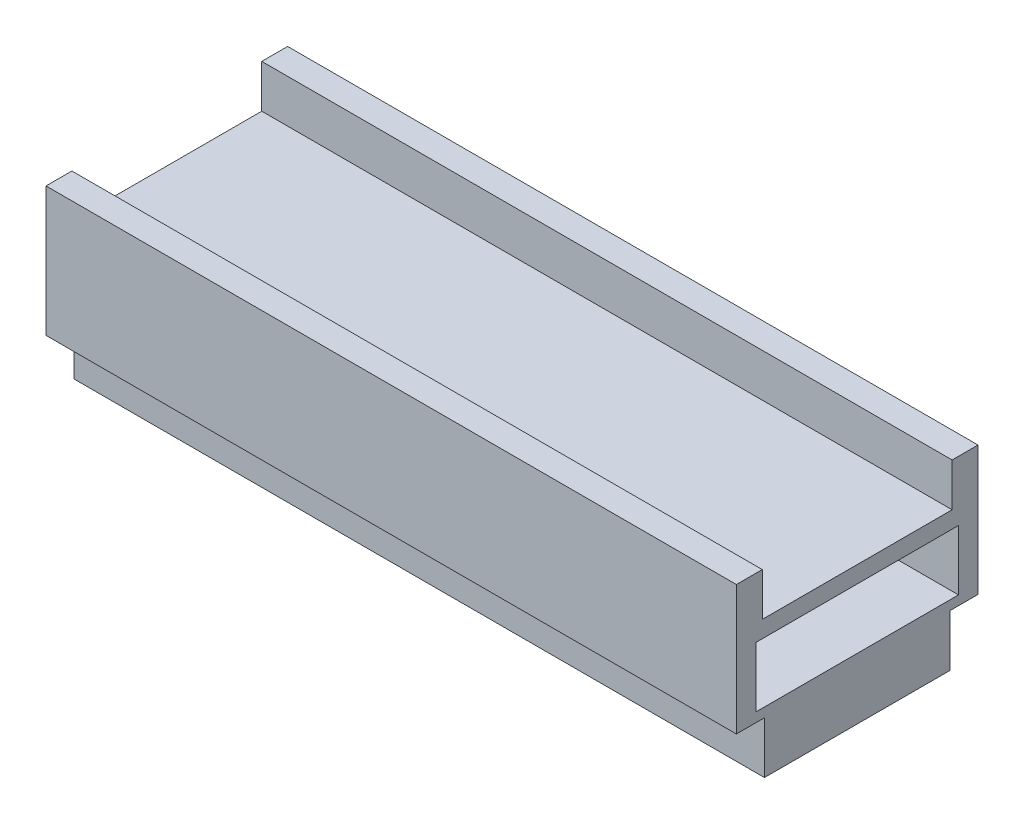
ISO-10303-21;
HEADER;
FILE_DESCRIPTION(('STEP AP214'),'2;1');
FILE_NAME('part.step','',(''),(''),'','','');
FILE_SCHEMA(('AUTOMOTIVE_DESIGN { 1 0 10303 214 1 1 1 1 }'));
ENDSEC;
DATA;
#1=APPLICATION_CONTEXT('core data for automotive mechanical design processes');
#2=APPLICATION_PROTOCOL_DEFINITION('international standard','automotive_design',2000,#1);
#3=PRODUCT_CONTEXT('',#1,'mechanical');
#4=PRODUCT('Part','Part','',(#3));
#5=PRODUCT_RELATED_PRODUCT_CATEGORY('part','',(#4));
#6=PRODUCT_DEFINITION_FORMATION('','',#4);
#7=PRODUCT_DEFINITION_CONTEXT('part definition',#1,'design');
#8=PRODUCT_DEFINITION('design','',#6,#7);
#9=PRODUCT_DEFINITION_SHAPE('','',#8);
#10=(LENGTH_UNIT() NAMED_UNIT(*) SI_UNIT(.MILLI.,.METRE.));
#11=(NAMED_UNIT(*) PLANE_ANGLE_UNIT() SI_UNIT($,.RADIAN.));
#12=(NAMED_UNIT(*) SI_UNIT($,.STERADIAN.) SOLID_ANGLE_UNIT());
#13=UNCERTAINTY_MEASURE_WITH_UNIT(LENGTH_MEASURE(1.E-05),#10,'distance_accuracy_value','');
#14=(GEOMETRIC_REPRESENTATION_CONTEXT(3) GLOBAL_UNCERTAINTY_ASSIGNED_CONTEXT((#13)) GLOBAL_UNIT_ASSIGNED_CONTEXT((#10,
#11,#12)) REPRESENTATION_CONTEXT('',''));
#15=CARTESIAN_POINT('',(0.,0.,0.));
#16=DIRECTION('',(0.,0.,1.));
#17=DIRECTION('',(1.,0.,0.));
#18=AXIS2_PLACEMENT_3D('',#15,#16,#17);
#19=CARTESIAN_POINT('',(0.,21.,0.));
#20=DIRECTION('',(0.,1.,0.));
#21=DIRECTION('',(0.,0.,1.));
#22=AXIS2_PLACEMENT_3D('',#19,#20,#21);
#23=PLANE('',#22);
#24=DIRECTION('',(-1.,0.,0.));
#25=VECTOR('',#24,1.);
#26=CARTESIAN_POINT('',(-40.,21.,-11.));
#27=LINE('',#26,#25);
#28=CARTESIAN_POINT('',(40.,21.,-11.));
#29=VERTEX_POINT('',#28);
#30=CARTESIAN_POINT('',(-40.,21.,-11.));
#31=VERTEX_POINT('',#30);
#32=EDGE_CURVE('E167',#29,#31,#27,.T.);
#33=ORIENTED_EDGE('',*,*,#32,.F.);
#34=DIRECTION('',(0.,0.,-1.));
#35=VECTOR('',#34,1.);
#36=CARTESIAN_POINT('',(40.,21.,-14.));
#37=LINE('',#36,#35);
#38=CARTESIAN_POINT('',(40.,21.,-14.));
#39=VERTEX_POINT('',#38);
#40=EDGE_CURVE('E220',#29,#39,#37,.T.);
#41=ORIENTED_EDGE('',*,*,#40,.T.);
#42=DIRECTION('',(-1.,0.,0.));
#43=VECTOR('',#42,1.);
#44=CARTESIAN_POINT('',(-40.,21.,-14.));
#45=LINE('',#44,#43);
#46=CARTESIAN_POINT('',(-40.,21.,-14.));
#47=VERTEX_POINT('',#46);
#48=EDGE_CURVE('E216',#39,#47,#45,.T.);
#49=ORIENTED_EDGE('',*,*,#48,.T.);
#50=DIRECTION('',(0.,0.,1.));
#51=VECTOR('',#50,1.);
#52=CARTESIAN_POINT('',(-40.,21.,-14.));
#53=LINE('',#52,#51);
#54=EDGE_CURVE('E219',#47,#31,#53,.T.);
#55=ORIENTED_EDGE('',*,*,#54,.T.);
#56=EDGE_LOOP('',(#33,#41,#49,#55));
#57=FACE_BOUND('',#56,.T.);
#58=ADVANCED_FACE('F39',(#57),#23,.T.);
#59=CARTESIAN_POINT('',(40.,6.,-10.75));
#60=DIRECTION('',(-1.,0.,0.));
#61=DIRECTION('',(0.,0.,1.));
#62=AXIS2_PLACEMENT_3D('',#59,#60,#61);
#63=PLANE('',#62);
#64=DIRECTION('',(0.,0.,1.));
#65=VECTOR('',#64,1.);
#66=CARTESIAN_POINT('',(40.,14.054050925553,11.7433662398209));
#67=LINE('',#66,#65);
#68=CARTESIAN_POINT('',(40.,14.054050925553,-11.7433662398209));
#69=VERTEX_POINT('',#68);
#70=CARTESIAN_POINT('',(40.,14.054050925553,11.7433662398209));
#71=VERTEX_POINT('',#70);
#72=EDGE_CURVE('E174',#69,#71,#67,.T.);
#73=ORIENTED_EDGE('',*,*,#72,.F.);
#74=DIRECTION('',(0.,1.,0.));
#75=VECTOR('',#74,1.);
#76=CARTESIAN_POINT('',(40.,14.054050925553,-11.7433662398209));
#77=LINE('',#76,#75);
#78=CARTESIAN_POINT('',(40.,7.0853236205476,-11.7433662398209));
#79=VERTEX_POINT('',#78);
#80=EDGE_CURVE('E53',#79,#69,#77,.T.);
#81=ORIENTED_EDGE('',*,*,#80,.F.);
#82=DIRECTION('',(0.,0.,-1.));
#83=VECTOR('',#82,1.);
#84=CARTESIAN_POINT('',(40.,7.0853236205476,11.7433662398209));
#85=LINE('',#84,#83);
#86=CARTESIAN_POINT('',(40.,7.0853236205476,11.7433662398209));
#87=VERTEX_POINT('',#86);
#88=EDGE_CURVE('E159',#87,#79,#85,.T.);
#89=ORIENTED_EDGE('',*,*,#88,.F.);
#90=DIRECTION('',(0.,-1.,0.));
#91=VECTOR('',#90,1.);
#92=CARTESIAN_POINT('',(40.,14.054050925553,11.7433662398209));
#93=LINE('',#92,#91);
#94=EDGE_CURVE('E180',#71,#87,#93,.T.);
#95=ORIENTED_EDGE('',*,*,#94,.F.);
#96=EDGE_LOOP('',(#73,#81,#89,#95));
#97=FACE_BOUND('',#96,.T.);
#98=DIRECTION('',(0.,0.,-1.));
#99=VECTOR('',#98,1.);
#100=CARTESIAN_POINT('',(40.,16.,-11.));
#101=LINE('',#100,#99);
#102=CARTESIAN_POINT('',(40.,16.,11.));
#103=VERTEX_POINT('',#102);
#104=CARTESIAN_POINT('',(40.,16.,-11.));
#105=VERTEX_POINT('',#104);
#106=EDGE_CURVE('E189',#103,#105,#101,.T.);
#107=ORIENTED_EDGE('',*,*,#106,.F.);
#108=DIRECTION('',(0.,1.,0.));
#109=VECTOR('',#108,1.);
#110=CARTESIAN_POINT('',(40.,16.,11.));
#111=LINE('',#110,#109);
#112=CARTESIAN_POINT('',(40.,21.,11.));
#113=VERTEX_POINT('',#112);
#114=EDGE_CURVE('E201',#103,#113,#111,.T.);
#115=ORIENTED_EDGE('',*,*,#114,.T.);
#116=CARTESIAN_POINT('',(40.,21.,14.));
#117=VERTEX_POINT('',#116);
#118=EDGE_CURVE('E213',#117,#113,#37,.T.);
#119=ORIENTED_EDGE('',*,*,#118,.F.);
#120=DIRECTION('',(0.,-1.,0.));
#121=VECTOR('',#120,1.);
#122=CARTESIAN_POINT('',(40.,21.,14.));
#123=LINE('',#122,#121);
#124=CARTESIAN_POINT('',(40.,6.,14.));
#125=VERTEX_POINT('',#124);
#126=EDGE_CURVE('E223',#117,#125,#123,.T.);
#127=ORIENTED_EDGE('',*,*,#126,.T.);
#128=DIRECTION('',(0.,0.,-1.));
#129=VECTOR('',#128,1.);
#130=CARTESIAN_POINT('',(40.,6.,-14.));
#131=LINE('',#130,#129);
#132=CARTESIAN_POINT('',(40.,6.,10.75));
#133=VERTEX_POINT('',#132);
#134=EDGE_CURVE('E227',#125,#133,#131,.T.);
#135=ORIENTED_EDGE('',*,*,#134,.T.);
#136=DIRECTION('',(0.,-1.,0.));
#137=VECTOR('',#136,1.);
#138=CARTESIAN_POINT('',(40.,6.,10.75));
#139=LINE('',#138,#137);
#140=CARTESIAN_POINT('',(40.,0.,10.75));
#141=VERTEX_POINT('',#140);
#142=EDGE_CURVE('E258',#133,#141,#139,.T.);
#143=ORIENTED_EDGE('',*,*,#142,.T.);
#144=DIRECTION('',(0.,0.,-1.));
#145=VECTOR('',#144,1.);
#146=CARTESIAN_POINT('',(40.,0.,-10.75));
#147=LINE('',#146,#145);
#148=CARTESIAN_POINT('',(40.,0.,-10.75));
#149=VERTEX_POINT('',#148);
#150=EDGE_CURVE('E249',#141,#149,#147,.T.);
#151=ORIENTED_EDGE('',*,*,#150,.T.);
#152=DIRECTION('',(0.,-1.,0.));
#153=VECTOR('',#152,1.);
#154=CARTESIAN_POINT('',(40.,6.,-10.75));
#155=LINE('',#154,#153);
#156=CARTESIAN_POINT('',(40.,6.,-10.75));
#157=VERTEX_POINT('',#156);
#158=EDGE_CURVE('E11',#157,#149,#155,.T.);
#159=ORIENTED_EDGE('',*,*,#158,.F.);
#160=CARTESIAN_POINT('',(40.,6.,-14.));
#161=VERTEX_POINT('',#160);
#162=EDGE_CURVE('E206',#157,#161,#131,.T.);
#163=ORIENTED_EDGE('',*,*,#162,.T.);
#164=DIRECTION('',(0.,-1.,0.));
#165=VECTOR('',#164,1.);
#166=CARTESIAN_POINT('',(40.,21.,-14.));
#167=LINE('',#166,#165);
#168=EDGE_CURVE('E241',#39,#161,#167,.T.);
#169=ORIENTED_EDGE('',*,*,#168,.F.);
#170=ORIENTED_EDGE('',*,*,#40,.F.);
#171=DIRECTION('',(0.,1.,0.));
#172=VECTOR('',#171,1.);
#173=CARTESIAN_POINT('',(40.,16.,-11.));
#174=LINE('',#173,#172);
#175=EDGE_CURVE('E199',#105,#29,#174,.T.);
#176=ORIENTED_EDGE('',*,*,#175,.F.);
#177=EDGE_LOOP('',(#107,#115,#119,#127,#135,#143,#151,#159,#163,#169,#170,#176));
#178=FACE_BOUND('',#177,.T.);
#179=ADVANCED_FACE('F41',(#97,#178),#63,.F.);
#180=CARTESIAN_POINT('',(-40.,6.,-10.75));
#181=DIRECTION('',(0.,0.,1.));
#182=DIRECTION('',(1.,0.,0.));
#183=AXIS2_PLACEMENT_3D('',#180,#181,#182);
#184=PLANE('',#183);
#185=DIRECTION('',(-1.,0.,0.));
#186=VECTOR('',#185,1.);
#187=CARTESIAN_POINT('',(-40.,0.,-10.75));
#188=LINE('',#187,#186);
#189=CARTESIAN_POINT('',(-40.,0.,-10.75));
#190=VERTEX_POINT('',#189);
#191=EDGE_CURVE('E259',#149,#190,#188,.T.);
#192=ORIENTED_EDGE('',*,*,#191,.T.);
#193=DIRECTION('',(0.,-1.,0.));
#194=VECTOR('',#193,1.);
#195=CARTESIAN_POINT('',(-40.,6.,-10.75));
#196=LINE('',#195,#194);
#197=CARTESIAN_POINT('',(-40.,6.,-10.75));
#198=VERTEX_POINT('',#197);
#199=EDGE_CURVE('E50',#198,#190,#196,.T.);
#200=ORIENTED_EDGE('',*,*,#199,.F.);
#201=DIRECTION('',(-1.,0.,0.));
#202=VECTOR('',#201,1.);
#203=CARTESIAN_POINT('',(-40.,6.,-10.75));
#204=LINE('',#203,#202);
#205=EDGE_CURVE('E248',#157,#198,#204,.T.);
#206=ORIENTED_EDGE('',*,*,#205,.F.);
#207=ORIENTED_EDGE('',*,*,#158,.T.);
#208=EDGE_LOOP('',(#192,#200,#206,#207));
#209=FACE_BOUND('',#208,.T.);
#210=ADVANCED_FACE('F319',(#209),#184,.F.);
#211=CARTESIAN_POINT('',(-40.,6.,-10.75));
#212=DIRECTION('',(1.,0.,0.));
#213=DIRECTION('',(0.,0.,-1.));
#214=AXIS2_PLACEMENT_3D('',#211,#212,#213);
#215=PLANE('',#214);
#216=DIRECTION('',(0.,0.,1.));
#217=VECTOR('',#216,1.);
#218=CARTESIAN_POINT('',(-40.,7.0853236205476,11.7433662398209));
#219=LINE('',#218,#217);
#220=CARTESIAN_POINT('',(-40.,7.0853236205476,-11.7433662398209));
#221=VERTEX_POINT('',#220);
#222=CARTESIAN_POINT('',(-40.,7.0853236205476,11.7433662398209));
#223=VERTEX_POINT('',#222);
#224=EDGE_CURVE('E175',#221,#223,#219,.T.);
#225=ORIENTED_EDGE('',*,*,#224,.F.);
#226=DIRECTION('',(0.,-1.,0.));
#227=VECTOR('',#226,1.);
#228=CARTESIAN_POINT('',(-40.,14.054050925553,-11.7433662398209));
#229=LINE('',#228,#227);
#230=CARTESIAN_POINT('',(-40.,14.054050925553,-11.7433662398209));
#231=VERTEX_POINT('',#230);
#232=EDGE_CURVE('E152',#231,#221,#229,.T.);
#233=ORIENTED_EDGE('',*,*,#232,.F.);
#234=DIRECTION('',(0.,0.,-1.));
#235=VECTOR('',#234,1.);
#236=CARTESIAN_POINT('',(-40.,14.054050925553,11.7433662398209));
#237=LINE('',#236,#235);
#238=CARTESIAN_POINT('',(-40.,14.054050925553,11.7433662398209));
#239=VERTEX_POINT('',#238);
#240=EDGE_CURVE('E162',#239,#231,#237,.T.);
#241=ORIENTED_EDGE('',*,*,#240,.F.);
#242=DIRECTION('',(0.,1.,0.));
#243=VECTOR('',#242,1.);
#244=CARTESIAN_POINT('',(-40.,14.054050925553,11.7433662398209));
#245=LINE('',#244,#243);
#246=EDGE_CURVE('E65',#223,#239,#245,.T.);
#247=ORIENTED_EDGE('',*,*,#246,.F.);
#248=EDGE_LOOP('',(#225,#233,#241,#247));
#249=FACE_BOUND('',#248,.T.);
#250=DIRECTION('',(0.,0.,1.));
#251=VECTOR('',#250,1.);
#252=CARTESIAN_POINT('',(-40.,16.,-11.));
#253=LINE('',#252,#251);
#254=CARTESIAN_POINT('',(-40.,16.,-11.));
#255=VERTEX_POINT('',#254);
#256=CARTESIAN_POINT('',(-40.,16.,11.));
#257=VERTEX_POINT('',#256);
#258=EDGE_CURVE('E195',#255,#257,#253,.T.);
#259=ORIENTED_EDGE('',*,*,#258,.F.);
#260=DIRECTION('',(0.,1.,0.));
#261=VECTOR('',#260,1.);
#262=CARTESIAN_POINT('',(-40.,16.,-11.));
#263=LINE('',#262,#261);
#264=EDGE_CURVE('E207',#255,#31,#263,.T.);
#265=ORIENTED_EDGE('',*,*,#264,.T.);
#266=ORIENTED_EDGE('',*,*,#54,.F.);
#267=DIRECTION('',(0.,-1.,0.));
#268=VECTOR('',#267,1.);
#269=CARTESIAN_POINT('',(-40.,21.,-14.));
#270=LINE('',#269,#268);
#271=CARTESIAN_POINT('',(-40.,6.,-14.));
#272=VERTEX_POINT('',#271);
#273=EDGE_CURVE('E245',#47,#272,#270,.T.);
#274=ORIENTED_EDGE('',*,*,#273,.T.);
#275=DIRECTION('',(0.,0.,1.));
#276=VECTOR('',#275,1.);
#277=CARTESIAN_POINT('',(-40.,6.,-14.));
#278=LINE('',#277,#276);
#279=EDGE_CURVE('E232',#272,#198,#278,.T.);
#280=ORIENTED_EDGE('',*,*,#279,.T.);
#281=ORIENTED_EDGE('',*,*,#199,.T.);
#282=DIRECTION('',(0.,0.,1.));
#283=VECTOR('',#282,1.);
#284=CARTESIAN_POINT('',(-40.,0.,-10.75));
#285=LINE('',#284,#283);
#286=CARTESIAN_POINT('',(-40.,0.,10.75));
#287=VERTEX_POINT('',#286);
#288=EDGE_CURVE('E261',#190,#287,#285,.T.);
#289=ORIENTED_EDGE('',*,*,#288,.T.);
#290=DIRECTION('',(0.,-1.,0.));
#291=VECTOR('',#290,1.);
#292=CARTESIAN_POINT('',(-40.,6.,10.75));
#293=LINE('',#292,#291);
#294=CARTESIAN_POINT('',(-40.,6.,10.75));
#295=VERTEX_POINT('',#294);
#296=EDGE_CURVE('E266',#295,#287,#293,.T.);
#297=ORIENTED_EDGE('',*,*,#296,.F.);
#298=CARTESIAN_POINT('',(-40.,6.,14.));
#299=VERTEX_POINT('',#298);
#300=EDGE_CURVE('E231',#295,#299,#278,.T.);
#301=ORIENTED_EDGE('',*,*,#300,.T.);
#302=DIRECTION('',(0.,-1.,0.));
#303=VECTOR('',#302,1.);
#304=CARTESIAN_POINT('',(-40.,21.,14.));
#305=LINE('',#304,#303);
#306=CARTESIAN_POINT('',(-40.,21.,14.));
#307=VERTEX_POINT('',#306);
#308=EDGE_CURVE('E239',#307,#299,#305,.T.);
#309=ORIENTED_EDGE('',*,*,#308,.F.);
#310=CARTESIAN_POINT('',(-40.,21.,11.));
#311=VERTEX_POINT('',#310);
#312=EDGE_CURVE('E218',#311,#307,#53,.T.);
#313=ORIENTED_EDGE('',*,*,#312,.F.);
#314=DIRECTION('',(0.,1.,0.));
#315=VECTOR('',#314,1.);
#316=CARTESIAN_POINT('',(-40.,16.,11.));
#317=LINE('',#316,#315);
#318=EDGE_CURVE('E210',#257,#311,#317,.T.);
#319=ORIENTED_EDGE('',*,*,#318,.F.);
#320=EDGE_LOOP('',(#259,#265,#266,#274,#280,#281,#289,#297,#301,#309,#313,#319));
#321=FACE_BOUND('',#320,.T.);
#322=ADVANCED_FACE('F166',(#249,#321),#215,.F.);
#323=CARTESIAN_POINT('',(-40.,6.,10.75));
#324=DIRECTION('',(0.,0.,-1.));
#325=DIRECTION('',(-1.,0.,0.));
#326=AXIS2_PLACEMENT_3D('',#323,#324,#325);
#327=PLANE('',#326);
#328=DIRECTION('',(1.,0.,0.));
#329=VECTOR('',#328,1.);
#330=CARTESIAN_POINT('',(-40.,0.,10.75));
#331=LINE('',#330,#329);
#332=EDGE_CURVE('E251',#287,#141,#331,.T.);
#333=ORIENTED_EDGE('',*,*,#332,.T.);
#334=ORIENTED_EDGE('',*,*,#142,.F.);
#335=DIRECTION('',(1.,0.,0.));
#336=VECTOR('',#335,1.);
#337=CARTESIAN_POINT('',(-40.,6.,10.75));
#338=LINE('',#337,#336);
#339=EDGE_CURVE('E252',#295,#133,#338,.T.);
#340=ORIENTED_EDGE('',*,*,#339,.F.);
#341=ORIENTED_EDGE('',*,*,#296,.T.);
#342=EDGE_LOOP('',(#333,#334,#340,#341));
#343=FACE_BOUND('',#342,.T.);
#344=ADVANCED_FACE('F279',(#343),#327,.F.);
#345=CARTESIAN_POINT('',(0.,0.,0.));
#346=DIRECTION('',(0.,1.,0.));
#347=DIRECTION('',(0.,0.,1.));
#348=AXIS2_PLACEMENT_3D('',#345,#346,#347);
#349=PLANE('',#348);
#350=ORIENTED_EDGE('',*,*,#150,.F.);
#351=ORIENTED_EDGE('',*,*,#332,.F.);
#352=ORIENTED_EDGE('',*,*,#288,.F.);
#353=ORIENTED_EDGE('',*,*,#191,.F.);
#354=EDGE_LOOP('',(#350,#351,#352,#353));
#355=FACE_BOUND('',#354,.T.);
#356=ADVANCED_FACE('F277',(#355),#349,.F.);
#357=CARTESIAN_POINT('',(0.,6.,0.));
#358=DIRECTION('',(0.,1.,0.));
#359=DIRECTION('',(0.,0.,1.));
#360=AXIS2_PLACEMENT_3D('',#357,#358,#359);
#361=PLANE('',#360);
#362=ORIENTED_EDGE('',*,*,#162,.F.);
#363=ORIENTED_EDGE('',*,*,#205,.T.);
#364=ORIENTED_EDGE('',*,*,#279,.F.);
#365=DIRECTION('',(-1.,0.,0.));
#366=VECTOR('',#365,1.);
#367=CARTESIAN_POINT('',(-40.,6.,-14.));
#368=LINE('',#367,#366);
#369=EDGE_CURVE('E229',#161,#272,#368,.T.);
#370=ORIENTED_EDGE('',*,*,#369,.F.);
#371=EDGE_LOOP('',(#362,#363,#364,#370));
#372=FACE_BOUND('',#371,.T.);
#373=ADVANCED_FACE('F317',(#372),#361,.F.);
#374=ORIENTED_EDGE('',*,*,#300,.F.);
#375=ORIENTED_EDGE('',*,*,#339,.T.);
#376=ORIENTED_EDGE('',*,*,#134,.F.);
#377=DIRECTION('',(1.,0.,0.));
#378=VECTOR('',#377,1.);
#379=CARTESIAN_POINT('',(-40.,6.,14.));
#380=LINE('',#379,#378);
#381=EDGE_CURVE('E235',#299,#125,#380,.T.);
#382=ORIENTED_EDGE('',*,*,#381,.F.);
#383=EDGE_LOOP('',(#374,#375,#376,#382));
#384=FACE_BOUND('',#383,.T.);
#385=ADVANCED_FACE('F288',(#384),#361,.F.);
#386=CARTESIAN_POINT('',(-40.,21.,-14.));
#387=DIRECTION('',(0.,0.,1.));
#388=DIRECTION('',(1.,0.,0.));
#389=AXIS2_PLACEMENT_3D('',#386,#387,#388);
#390=PLANE('',#389);
#391=ORIENTED_EDGE('',*,*,#369,.T.);
#392=ORIENTED_EDGE('',*,*,#273,.F.);
#393=ORIENTED_EDGE('',*,*,#48,.F.);
#394=ORIENTED_EDGE('',*,*,#168,.T.);
#395=EDGE_LOOP('',(#391,#392,#393,#394));
#396=FACE_BOUND('',#395,.T.);
#397=ADVANCED_FACE('F321',(#396),#390,.F.);
#398=CARTESIAN_POINT('',(-40.,21.,14.));
#399=DIRECTION('',(0.,0.,-1.));
#400=DIRECTION('',(-1.,0.,0.));
#401=AXIS2_PLACEMENT_3D('',#398,#399,#400);
#402=PLANE('',#401);
#403=ORIENTED_EDGE('',*,*,#381,.T.);
#404=ORIENTED_EDGE('',*,*,#126,.F.);
#405=DIRECTION('',(1.,0.,0.));
#406=VECTOR('',#405,1.);
#407=CARTESIAN_POINT('',(-40.,21.,14.));
#408=LINE('',#407,#406);
#409=EDGE_CURVE('E224',#307,#117,#408,.T.);
#410=ORIENTED_EDGE('',*,*,#409,.F.);
#411=ORIENTED_EDGE('',*,*,#308,.T.);
#412=EDGE_LOOP('',(#403,#404,#410,#411));
#413=FACE_BOUND('',#412,.T.);
#414=ADVANCED_FACE('F294',(#413),#402,.F.);
#415=DIRECTION('',(1.,0.,0.));
#416=VECTOR('',#415,1.);
#417=CARTESIAN_POINT('',(-40.,21.,11.));
#418=LINE('',#417,#416);
#419=EDGE_CURVE('E194',#311,#113,#418,.T.);
#420=ORIENTED_EDGE('',*,*,#419,.F.);
#421=ORIENTED_EDGE('',*,*,#312,.T.);
#422=ORIENTED_EDGE('',*,*,#409,.T.);
#423=ORIENTED_EDGE('',*,*,#118,.T.);
#424=EDGE_LOOP('',(#420,#421,#422,#423));
#425=FACE_BOUND('',#424,.T.);
#426=ADVANCED_FACE('F300',(#425),#23,.T.);
#427=CARTESIAN_POINT('',(-40.,16.,11.));
#428=DIRECTION('',(0.,0.,1.));
#429=DIRECTION('',(1.,0.,0.));
#430=AXIS2_PLACEMENT_3D('',#427,#428,#429);
#431=PLANE('',#430);
#432=ORIENTED_EDGE('',*,*,#419,.T.);
#433=ORIENTED_EDGE('',*,*,#114,.F.);
#434=DIRECTION('',(1.,0.,0.));
#435=VECTOR('',#434,1.);
#436=CARTESIAN_POINT('',(-40.,16.,11.));
#437=LINE('',#436,#435);
#438=EDGE_CURVE('E197',#257,#103,#437,.T.);
#439=ORIENTED_EDGE('',*,*,#438,.F.);
#440=ORIENTED_EDGE('',*,*,#318,.T.);
#441=EDGE_LOOP('',(#432,#433,#439,#440));
#442=FACE_BOUND('',#441,.T.);
#443=ADVANCED_FACE('F301',(#442),#431,.F.);
#444=CARTESIAN_POINT('',(-40.,16.,-11.));
#445=DIRECTION('',(0.,0.,-1.));
#446=DIRECTION('',(-1.,0.,0.));
#447=AXIS2_PLACEMENT_3D('',#444,#445,#446);
#448=PLANE('',#447);
#449=ORIENTED_EDGE('',*,*,#32,.T.);
#450=ORIENTED_EDGE('',*,*,#264,.F.);
#451=DIRECTION('',(-1.,0.,0.));
#452=VECTOR('',#451,1.);
#453=CARTESIAN_POINT('',(-40.,16.,-11.));
#454=LINE('',#453,#452);
#455=EDGE_CURVE('E192',#105,#255,#454,.T.);
#456=ORIENTED_EDGE('',*,*,#455,.F.);
#457=ORIENTED_EDGE('',*,*,#175,.T.);
#458=EDGE_LOOP('',(#449,#450,#456,#457));
#459=FACE_BOUND('',#458,.T.);
#460=ADVANCED_FACE('F310',(#459),#448,.F.);
#461=CARTESIAN_POINT('',(0.,16.,0.));
#462=DIRECTION('',(0.,1.,0.));
#463=DIRECTION('',(0.,0.,1.));
#464=AXIS2_PLACEMENT_3D('',#461,#462,#463);
#465=PLANE('',#464);
#466=ORIENTED_EDGE('',*,*,#106,.T.);
#467=ORIENTED_EDGE('',*,*,#455,.T.);
#468=ORIENTED_EDGE('',*,*,#258,.T.);
#469=ORIENTED_EDGE('',*,*,#438,.T.);
#470=EDGE_LOOP('',(#466,#467,#468,#469));
#471=FACE_BOUND('',#470,.T.);
#472=ADVANCED_FACE('F304',(#471),#465,.T.);
#473=CARTESIAN_POINT('',(-40.001,14.054050925553,-11.7433662398209));
#474=DIRECTION('',(0.,0.,-1.));
#475=DIRECTION('',(0.,1.,0.));
#476=AXIS2_PLACEMENT_3D('',#473,#474,#475);
#477=PLANE('',#476);
#478=ORIENTED_EDGE('',*,*,#232,.T.);
#479=DIRECTION('',(1.,0.,0.));
#480=VECTOR('',#479,1.);
#481=CARTESIAN_POINT('',(-40.001,7.0853236205476,-11.7433662398209));
#482=LINE('',#481,#480);
#483=EDGE_CURVE('E170',#221,#79,#482,.T.);
#484=ORIENTED_EDGE('',*,*,#483,.T.);
#485=ORIENTED_EDGE('',*,*,#80,.T.);
#486=DIRECTION('',(1.,0.,0.));
#487=VECTOR('',#486,1.);
#488=CARTESIAN_POINT('',(-40.001,14.054050925553,-11.7433662398209));
#489=LINE('',#488,#487);
#490=EDGE_CURVE('E147',#231,#69,#489,.T.);
#491=ORIENTED_EDGE('',*,*,#490,.F.);
#492=EDGE_LOOP('',(#478,#484,#485,#491));
#493=FACE_BOUND('',#492,.T.);
#494=ADVANCED_FACE('F155',(#493),#477,.F.);
#495=CARTESIAN_POINT('',(-40.001,7.0853236205476,11.7433662398209));
#496=DIRECTION('',(0.,-1.,0.));
#497=DIRECTION('',(0.,0.,-1.));
#498=AXIS2_PLACEMENT_3D('',#495,#496,#497);
#499=PLANE('',#498);
#500=ORIENTED_EDGE('',*,*,#224,.T.);
#501=DIRECTION('',(1.,0.,0.));
#502=VECTOR('',#501,1.);
#503=CARTESIAN_POINT('',(-40.001,7.0853236205476,11.7433662398209));
#504=LINE('',#503,#502);
#505=EDGE_CURVE('E187',#223,#87,#504,.T.);
#506=ORIENTED_EDGE('',*,*,#505,.T.);
#507=ORIENTED_EDGE('',*,*,#88,.T.);
#508=ORIENTED_EDGE('',*,*,#483,.F.);
#509=EDGE_LOOP('',(#500,#506,#507,#508));
#510=FACE_BOUND('',#509,.T.);
#511=ADVANCED_FACE('F352',(#510),#499,.F.);
#512=CARTESIAN_POINT('',(-40.001,14.054050925553,11.7433662398209));
#513=DIRECTION('',(0.,0.,1.));
#514=DIRECTION('',(1.,0.,0.));
#515=AXIS2_PLACEMENT_3D('',#512,#513,#514);
#516=PLANE('',#515);
#517=ORIENTED_EDGE('',*,*,#246,.T.);
#518=DIRECTION('',(1.,0.,0.));
#519=VECTOR('',#518,1.);
#520=CARTESIAN_POINT('',(-40.001,14.054050925553,11.7433662398209));
#521=LINE('',#520,#519);
#522=EDGE_CURVE('E157',#239,#71,#521,.T.);
#523=ORIENTED_EDGE('',*,*,#522,.T.);
#524=ORIENTED_EDGE('',*,*,#94,.T.);
#525=ORIENTED_EDGE('',*,*,#505,.F.);
#526=EDGE_LOOP('',(#517,#523,#524,#525));
#527=FACE_BOUND('',#526,.T.);
#528=ADVANCED_FACE('F354',(#527),#516,.F.);
#529=CARTESIAN_POINT('',(-40.001,14.054050925553,11.7433662398209));
#530=DIRECTION('',(0.,1.,0.));
#531=DIRECTION('',(0.,0.,1.));
#532=AXIS2_PLACEMENT_3D('',#529,#530,#531);
#533=PLANE('',#532);
#534=ORIENTED_EDGE('',*,*,#240,.T.);
#535=ORIENTED_EDGE('',*,*,#490,.T.);
#536=ORIENTED_EDGE('',*,*,#72,.T.);
#537=ORIENTED_EDGE('',*,*,#522,.F.);
#538=EDGE_LOOP('',(#534,#535,#536,#537));
#539=FACE_BOUND('',#538,.T.);
#540=ADVANCED_FACE('F163',(#539),#533,.F.);
#541=CLOSED_SHELL('',(#58,#179,#210,#322,#344,#356,#373,#385,#397,#414,#426,#443,#460,#472,#494,
#511,#528,#540));
#542=MANIFOLD_SOLID_BREP('B2',#541);
#543=ADVANCED_BREP_SHAPE_REPRESENTATION('',(#18,#542),#14);
#544=SHAPE_DEFINITION_REPRESENTATION(#9,#543);
ENDSEC;
END-ISO-10303-21;
